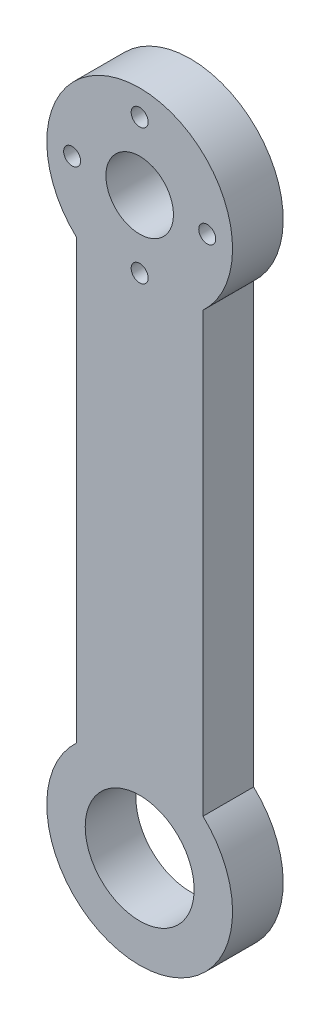
ISO-10303-21;
HEADER;
FILE_DESCRIPTION(('STEP AP214'),'2;1');
FILE_NAME('part.step','',(''),(''),'','','');
FILE_SCHEMA(('AUTOMOTIVE_DESIGN { 1 0 10303 214 1 1 1 1 }'));
ENDSEC;
DATA;
#1=APPLICATION_CONTEXT('core data for automotive mechanical design processes');
#2=APPLICATION_PROTOCOL_DEFINITION('international standard','automotive_design',2000,#1);
#3=PRODUCT_CONTEXT('',#1,'mechanical');
#4=PRODUCT('Part','Part','',(#3));
#5=PRODUCT_RELATED_PRODUCT_CATEGORY('part','',(#4));
#6=PRODUCT_DEFINITION_FORMATION('','',#4);
#7=PRODUCT_DEFINITION_CONTEXT('part definition',#1,'design');
#8=PRODUCT_DEFINITION('design','',#6,#7);
#9=PRODUCT_DEFINITION_SHAPE('','',#8);
#10=(LENGTH_UNIT() NAMED_UNIT(*) SI_UNIT(.MILLI.,.METRE.));
#11=(NAMED_UNIT(*) PLANE_ANGLE_UNIT() SI_UNIT($,.RADIAN.));
#12=(NAMED_UNIT(*) SI_UNIT($,.STERADIAN.) SOLID_ANGLE_UNIT());
#13=UNCERTAINTY_MEASURE_WITH_UNIT(LENGTH_MEASURE(1.E-05),#10,'distance_accuracy_value','');
#14=(GEOMETRIC_REPRESENTATION_CONTEXT(3) GLOBAL_UNCERTAINTY_ASSIGNED_CONTEXT((#13)) GLOBAL_UNIT_ASSIGNED_CONTEXT((#10,
#11,#12)) REPRESENTATION_CONTEXT('',''));
#15=CARTESIAN_POINT('',(0.,0.,0.));
#16=DIRECTION('',(0.,0.,1.));
#17=DIRECTION('',(1.,0.,0.));
#18=AXIS2_PLACEMENT_3D('',#15,#16,#17);
#19=CARTESIAN_POINT('',(7.5,67.5,10.));
#20=DIRECTION('',(0.,0.,-1.));
#21=DIRECTION('',(-1.,0.,0.));
#22=AXIS2_PLACEMENT_3D('',#19,#20,#21);
#23=CYLINDRICAL_SURFACE('',#22,1.00499999999999);
#24=CARTESIAN_POINT('',(7.5,67.5,6.));
#25=DIRECTION('',(0.,0.,-1.));
#26=DIRECTION('',(-1.,0.,0.));
#27=AXIS2_PLACEMENT_3D('',#24,#25,#26);
#28=CIRCLE('',#27,1.00499999999999);
#29=CARTESIAN_POINT('',(6.49500000000001,67.5,6.));
#30=VERTEX_POINT('',#29);
#31=EDGE_CURVE('E150',#30,#30,#28,.T.);
#32=ORIENTED_EDGE('',*,*,#31,.F.);
#33=EDGE_LOOP('',(#32));
#34=FACE_BOUND('',#33,.T.);
#35=CARTESIAN_POINT('',(7.5,67.5,4.));
#36=DIRECTION('',(0.,0.,-1.));
#37=DIRECTION('',(-1.,0.,0.));
#38=AXIS2_PLACEMENT_3D('',#35,#36,#37);
#39=CIRCLE('',#38,1.00499999999999);
#40=CARTESIAN_POINT('',(6.49500000000001,67.5,4.));
#41=VERTEX_POINT('',#40);
#42=EDGE_CURVE('E38',#41,#41,#39,.F.);
#43=ORIENTED_EDGE('',*,*,#42,.F.);
#44=EDGE_LOOP('',(#43));
#45=FACE_BOUND('',#44,.T.);
#46=ADVANCED_FACE('F34',(#34,#45),#23,.F.);
#47=CARTESIAN_POINT('',(-0.5,75.5,10.));
#48=DIRECTION('',(0.,0.,-1.));
#49=DIRECTION('',(-1.,0.,0.));
#50=AXIS2_PLACEMENT_3D('',#47,#48,#49);
#51=CYLINDRICAL_SURFACE('',#50,1.00499999999999);
#52=CARTESIAN_POINT('',(-0.5,75.5,6.));
#53=DIRECTION('',(0.,0.,-1.));
#54=DIRECTION('',(-1.,0.,0.));
#55=AXIS2_PLACEMENT_3D('',#52,#53,#54);
#56=CIRCLE('',#55,1.00499999999999);
#57=CARTESIAN_POINT('',(-1.50499999999999,75.5,6.));
#58=VERTEX_POINT('',#57);
#59=EDGE_CURVE('E141',#58,#58,#56,.T.);
#60=ORIENTED_EDGE('',*,*,#59,.F.);
#61=EDGE_LOOP('',(#60));
#62=FACE_BOUND('',#61,.T.);
#63=CARTESIAN_POINT('',(-0.5,75.5,4.));
#64=DIRECTION('',(0.,0.,-1.));
#65=DIRECTION('',(-1.,0.,0.));
#66=AXIS2_PLACEMENT_3D('',#63,#64,#65);
#67=CIRCLE('',#66,1.00499999999999);
#68=CARTESIAN_POINT('',(-1.50499999999999,75.5,4.));
#69=VERTEX_POINT('',#68);
#70=EDGE_CURVE('E111',#69,#69,#67,.F.);
#71=ORIENTED_EDGE('',*,*,#70,.F.);
#72=EDGE_LOOP('',(#71));
#73=FACE_BOUND('',#72,.T.);
#74=ADVANCED_FACE('F182',(#62,#73),#51,.F.);
#75=CARTESIAN_POINT('',(7.5,83.5,10.));
#76=DIRECTION('',(0.,0.,-1.));
#77=DIRECTION('',(-1.,0.,0.));
#78=AXIS2_PLACEMENT_3D('',#75,#76,#77);
#79=CYLINDRICAL_SURFACE('',#78,1.00500000000002);
#80=CARTESIAN_POINT('',(7.5,83.5,6.));
#81=DIRECTION('',(0.,0.,-1.));
#82=DIRECTION('',(-1.,0.,0.));
#83=AXIS2_PLACEMENT_3D('',#80,#81,#82);
#84=CIRCLE('',#83,1.00500000000002);
#85=CARTESIAN_POINT('',(6.49499999999998,83.5,6.));
#86=VERTEX_POINT('',#85);
#87=EDGE_CURVE('E144',#86,#86,#84,.T.);
#88=ORIENTED_EDGE('',*,*,#87,.F.);
#89=EDGE_LOOP('',(#88));
#90=FACE_BOUND('',#89,.T.);
#91=CARTESIAN_POINT('',(7.5,83.5,4.));
#92=DIRECTION('',(0.,0.,-1.));
#93=DIRECTION('',(-1.,0.,0.));
#94=AXIS2_PLACEMENT_3D('',#91,#92,#93);
#95=CIRCLE('',#94,1.00500000000002);
#96=CARTESIAN_POINT('',(6.49499999999998,83.5,4.));
#97=VERTEX_POINT('',#96);
#98=EDGE_CURVE('E107',#97,#97,#95,.F.);
#99=ORIENTED_EDGE('',*,*,#98,.F.);
#100=EDGE_LOOP('',(#99));
#101=FACE_BOUND('',#100,.T.);
#102=ADVANCED_FACE('F188',(#90,#101),#79,.F.);
#103=CARTESIAN_POINT('',(15.5,75.5,10.));
#104=DIRECTION('',(0.,0.,-1.));
#105=DIRECTION('',(-1.,0.,0.));
#106=AXIS2_PLACEMENT_3D('',#103,#104,#105);
#107=CYLINDRICAL_SURFACE('',#106,1.005);
#108=CARTESIAN_POINT('',(15.5,75.5,6.));
#109=DIRECTION('',(0.,0.,-1.));
#110=DIRECTION('',(-1.,0.,0.));
#111=AXIS2_PLACEMENT_3D('',#108,#109,#110);
#112=CIRCLE('',#111,1.005);
#113=CARTESIAN_POINT('',(14.495,75.5,6.));
#114=VERTEX_POINT('',#113);
#115=EDGE_CURVE('E147',#114,#114,#112,.T.);
#116=ORIENTED_EDGE('',*,*,#115,.F.);
#117=EDGE_LOOP('',(#116));
#118=FACE_BOUND('',#117,.T.);
#119=CARTESIAN_POINT('',(15.5,75.5,4.));
#120=DIRECTION('',(0.,0.,-1.));
#121=DIRECTION('',(-1.,0.,0.));
#122=AXIS2_PLACEMENT_3D('',#119,#120,#121);
#123=CIRCLE('',#122,1.005);
#124=CARTESIAN_POINT('',(14.495,75.5,4.));
#125=VERTEX_POINT('',#124);
#126=EDGE_CURVE('E102',#125,#125,#123,.F.);
#127=ORIENTED_EDGE('',*,*,#126,.F.);
#128=EDGE_LOOP('',(#127));
#129=FACE_BOUND('',#128,.T.);
#130=ADVANCED_FACE('F195',(#118,#129),#107,.F.);
#131=CARTESIAN_POINT('',(0.,0.,6.));
#132=DIRECTION('',(1.,0.,0.));
#133=DIRECTION('',(0.,0.,-1.));
#134=AXIS2_PLACEMENT_3D('',#131,#132,#133);
#135=PLANE('',#134);
#136=DIRECTION('',(0.,-1.,0.));
#137=VECTOR('',#136,1.);
#138=CARTESIAN_POINT('',(0.,0.,6.));
#139=LINE('',#138,#137);
#140=CARTESIAN_POINT('',(0.,67.4532615302845,6.));
#141=VERTEX_POINT('',#140);
#142=CARTESIAN_POINT('',(0.,15.5467384697156,6.));
#143=VERTEX_POINT('',#142);
#144=EDGE_CURVE('E43',#141,#143,#139,.T.);
#145=ORIENTED_EDGE('',*,*,#144,.F.);
#146=DIRECTION('',(0.,0.,1.));
#147=VECTOR('',#146,1.);
#148=CARTESIAN_POINT('',(0.,67.4532615302845,0.));
#149=LINE('',#148,#147);
#150=CARTESIAN_POINT('',(0.,67.4532615302845,0.));
#151=VERTEX_POINT('',#150);
#152=EDGE_CURVE('E77',#141,#151,#149,.F.);
#153=ORIENTED_EDGE('',*,*,#152,.T.);
#154=DIRECTION('',(0.,-1.,0.));
#155=VECTOR('',#154,1.);
#156=CARTESIAN_POINT('',(0.,0.,0.));
#157=LINE('',#156,#155);
#158=CARTESIAN_POINT('',(0.,15.5467384697156,0.));
#159=VERTEX_POINT('',#158);
#160=EDGE_CURVE('E88',#151,#159,#157,.T.);
#161=ORIENTED_EDGE('',*,*,#160,.T.);
#162=DIRECTION('',(0.,0.,1.));
#163=VECTOR('',#162,1.);
#164=CARTESIAN_POINT('',(0.,15.5467384697156,0.));
#165=LINE('',#164,#163);
#166=EDGE_CURVE('E95',#159,#143,#165,.T.);
#167=ORIENTED_EDGE('',*,*,#166,.T.);
#168=EDGE_LOOP('',(#145,#153,#161,#167));
#169=FACE_BOUND('',#168,.T.);
#170=ADVANCED_FACE('F36',(#169),#135,.F.);
#171=CARTESIAN_POINT('',(15.,0.,6.));
#172=DIRECTION('',(-1.,0.,0.));
#173=DIRECTION('',(0.,0.,1.));
#174=AXIS2_PLACEMENT_3D('',#171,#172,#173);
#175=PLANE('',#174);
#176=DIRECTION('',(0.,1.,0.));
#177=VECTOR('',#176,1.);
#178=CARTESIAN_POINT('',(15.,0.,0.));
#179=LINE('',#178,#177);
#180=CARTESIAN_POINT('',(15.,15.5467384697156,0.));
#181=VERTEX_POINT('',#180);
#182=CARTESIAN_POINT('',(15.,67.4532615302845,0.));
#183=VERTEX_POINT('',#182);
#184=EDGE_CURVE('E94',#181,#183,#179,.T.);
#185=ORIENTED_EDGE('',*,*,#184,.T.);
#186=DIRECTION('',(0.,0.,1.));
#187=VECTOR('',#186,1.);
#188=CARTESIAN_POINT('',(15.,67.4532615302845,0.));
#189=LINE('',#188,#187);
#190=CARTESIAN_POINT('',(15.,67.4532615302845,6.));
#191=VERTEX_POINT('',#190);
#192=EDGE_CURVE('E79',#183,#191,#189,.T.);
#193=ORIENTED_EDGE('',*,*,#192,.T.);
#194=DIRECTION('',(0.,1.,0.));
#195=VECTOR('',#194,1.);
#196=CARTESIAN_POINT('',(15.,0.,6.));
#197=LINE('',#196,#195);
#198=CARTESIAN_POINT('',(15.,15.5467384697156,6.));
#199=VERTEX_POINT('',#198);
#200=EDGE_CURVE('E11',#199,#191,#197,.T.);
#201=ORIENTED_EDGE('',*,*,#200,.F.);
#202=DIRECTION('',(0.,0.,1.));
#203=VECTOR('',#202,1.);
#204=CARTESIAN_POINT('',(15.,15.5467384697156,0.));
#205=LINE('',#204,#203);
#206=EDGE_CURVE('E98',#199,#181,#205,.F.);
#207=ORIENTED_EDGE('',*,*,#206,.T.);
#208=EDGE_LOOP('',(#185,#193,#201,#207));
#209=FACE_BOUND('',#208,.T.);
#210=ADVANCED_FACE('F166',(#209),#175,.F.);
#211=CARTESIAN_POINT('',(0.,0.,6.));
#212=DIRECTION('',(0.,0.,-1.));
#213=DIRECTION('',(-1.,0.,0.));
#214=AXIS2_PLACEMENT_3D('',#211,#212,#213);
#215=PLANE('',#214);
#216=CARTESIAN_POINT('',(7.5,7.5,6.));
#217=DIRECTION('',(0.,0.,-1.));
#218=DIRECTION('',(-1.,0.,0.));
#219=AXIS2_PLACEMENT_3D('',#216,#217,#218);
#220=CIRCLE('',#219,6.45);
#221=CARTESIAN_POINT('',(1.05,7.5,6.));
#222=VERTEX_POINT('',#221);
#223=EDGE_CURVE('E138',#222,#222,#220,.T.);
#224=ORIENTED_EDGE('',*,*,#223,.T.);
#225=EDGE_LOOP('',(#224));
#226=FACE_BOUND('',#225,.T.);
#227=ORIENTED_EDGE('',*,*,#59,.T.);
#228=EDGE_LOOP('',(#227));
#229=FACE_BOUND('',#228,.T.);
#230=ORIENTED_EDGE('',*,*,#87,.T.);
#231=EDGE_LOOP('',(#230));
#232=FACE_BOUND('',#231,.T.);
#233=ORIENTED_EDGE('',*,*,#115,.T.);
#234=EDGE_LOOP('',(#233));
#235=FACE_BOUND('',#234,.T.);
#236=ORIENTED_EDGE('',*,*,#31,.T.);
#237=EDGE_LOOP('',(#236));
#238=FACE_BOUND('',#237,.T.);
#239=CARTESIAN_POINT('',(7.5,75.5,6.));
#240=DIRECTION('',(0.,0.,-1.));
#241=DIRECTION('',(-1.,0.,0.));
#242=AXIS2_PLACEMENT_3D('',#239,#240,#241);
#243=CIRCLE('',#242,4.);
#244=CARTESIAN_POINT('',(3.5,75.5,6.));
#245=VERTEX_POINT('',#244);
#246=EDGE_CURVE('E156',#245,#245,#243,.T.);
#247=ORIENTED_EDGE('',*,*,#246,.T.);
#248=EDGE_LOOP('',(#247));
#249=FACE_BOUND('',#248,.T.);
#250=CARTESIAN_POINT('',(7.5,75.5,6.));
#251=DIRECTION('',(0.,0.,1.));
#252=DIRECTION('',(1.,0.,0.));
#253=AXIS2_PLACEMENT_3D('',#250,#251,#252);
#254=CIRCLE('',#253,11.);
#255=EDGE_CURVE('E84',#191,#141,#254,.T.);
#256=ORIENTED_EDGE('',*,*,#255,.T.);
#257=ORIENTED_EDGE('',*,*,#144,.T.);
#258=CARTESIAN_POINT('',(7.5,7.5,6.));
#259=DIRECTION('',(0.,0.,1.));
#260=DIRECTION('',(1.,0.,0.));
#261=AXIS2_PLACEMENT_3D('',#258,#259,#260);
#262=CIRCLE('',#261,11.);
#263=EDGE_CURVE('E50',#143,#199,#262,.T.);
#264=ORIENTED_EDGE('',*,*,#263,.T.);
#265=ORIENTED_EDGE('',*,*,#200,.T.);
#266=EDGE_LOOP('',(#256,#257,#264,#265));
#267=FACE_BOUND('',#266,.T.);
#268=ADVANCED_FACE('F177',(#226,#229,#232,#235,#238,#249,#267),#215,.F.);
#269=CARTESIAN_POINT('',(0.,0.,0.));
#270=DIRECTION('',(0.,0.,-1.));
#271=DIRECTION('',(-1.,0.,0.));
#272=AXIS2_PLACEMENT_3D('',#269,#270,#271);
#273=PLANE('',#272);
#274=CARTESIAN_POINT('',(7.5,67.5,0.));
#275=DIRECTION('',(0.,0.,-1.));
#276=DIRECTION('',(-1.,0.,0.));
#277=AXIS2_PLACEMENT_3D('',#274,#275,#276);
#278=CIRCLE('',#277,2.00000000000001);
#279=CARTESIAN_POINT('',(5.49999999999999,67.5,0.));
#280=VERTEX_POINT('',#279);
#281=EDGE_CURVE('E127',#280,#280,#278,.T.);
#282=ORIENTED_EDGE('',*,*,#281,.F.);
#283=EDGE_LOOP('',(#282));
#284=FACE_BOUND('',#283,.T.);
#285=CARTESIAN_POINT('',(-0.5,75.5,0.));
#286=DIRECTION('',(0.,0.,-1.));
#287=DIRECTION('',(-1.,0.,0.));
#288=AXIS2_PLACEMENT_3D('',#285,#286,#287);
#289=CIRCLE('',#288,2.00000000000001);
#290=CARTESIAN_POINT('',(-2.50000000000001,75.5,0.));
#291=VERTEX_POINT('',#290);
#292=EDGE_CURVE('E120',#291,#291,#289,.T.);
#293=ORIENTED_EDGE('',*,*,#292,.F.);
#294=EDGE_LOOP('',(#293));
#295=FACE_BOUND('',#294,.T.);
#296=CARTESIAN_POINT('',(7.5,83.5,0.));
#297=DIRECTION('',(0.,0.,-1.));
#298=DIRECTION('',(-1.,0.,0.));
#299=AXIS2_PLACEMENT_3D('',#296,#297,#298);
#300=CIRCLE('',#299,2.);
#301=CARTESIAN_POINT('',(5.5,83.5,0.));
#302=VERTEX_POINT('',#301);
#303=EDGE_CURVE('E113',#302,#302,#300,.T.);
#304=ORIENTED_EDGE('',*,*,#303,.F.);
#305=EDGE_LOOP('',(#304));
#306=FACE_BOUND('',#305,.T.);
#307=CARTESIAN_POINT('',(15.5,75.5,0.));
#308=DIRECTION('',(0.,0.,-1.));
#309=DIRECTION('',(-1.,0.,0.));
#310=AXIS2_PLACEMENT_3D('',#307,#308,#309);
#311=CIRCLE('',#310,2.);
#312=CARTESIAN_POINT('',(13.5,75.5,0.));
#313=VERTEX_POINT('',#312);
#314=EDGE_CURVE('E109',#313,#313,#311,.T.);
#315=ORIENTED_EDGE('',*,*,#314,.F.);
#316=EDGE_LOOP('',(#315));
#317=FACE_BOUND('',#316,.T.);
#318=CARTESIAN_POINT('',(7.5,7.5,0.));
#319=DIRECTION('',(0.,0.,-1.));
#320=DIRECTION('',(-1.,0.,0.));
#321=AXIS2_PLACEMENT_3D('',#318,#319,#320);
#322=CIRCLE('',#321,6.45);
#323=CARTESIAN_POINT('',(1.05,7.5,0.));
#324=VERTEX_POINT('',#323);
#325=EDGE_CURVE('E105',#324,#324,#322,.T.);
#326=ORIENTED_EDGE('',*,*,#325,.F.);
#327=EDGE_LOOP('',(#326));
#328=FACE_BOUND('',#327,.T.);
#329=CARTESIAN_POINT('',(7.5,75.5,0.));
#330=DIRECTION('',(0.,0.,-1.));
#331=DIRECTION('',(-1.,0.,0.));
#332=AXIS2_PLACEMENT_3D('',#329,#330,#331);
#333=CIRCLE('',#332,4.);
#334=CARTESIAN_POINT('',(3.5,75.5,0.));
#335=VERTEX_POINT('',#334);
#336=EDGE_CURVE('E153',#335,#335,#333,.T.);
#337=ORIENTED_EDGE('',*,*,#336,.F.);
#338=EDGE_LOOP('',(#337));
#339=FACE_BOUND('',#338,.T.);
#340=ORIENTED_EDGE('',*,*,#160,.F.);
#341=CARTESIAN_POINT('',(7.5,75.5,0.));
#342=DIRECTION('',(0.,0.,1.));
#343=DIRECTION('',(1.,0.,0.));
#344=AXIS2_PLACEMENT_3D('',#341,#342,#343);
#345=CIRCLE('',#344,11.);
#346=EDGE_CURVE('E74',#183,#151,#345,.T.);
#347=ORIENTED_EDGE('',*,*,#346,.F.);
#348=ORIENTED_EDGE('',*,*,#184,.F.);
#349=CARTESIAN_POINT('',(7.5,7.5,0.));
#350=DIRECTION('',(0.,0.,1.));
#351=DIRECTION('',(1.,0.,0.));
#352=AXIS2_PLACEMENT_3D('',#349,#350,#351);
#353=CIRCLE('',#352,11.);
#354=EDGE_CURVE('E93',#159,#181,#353,.T.);
#355=ORIENTED_EDGE('',*,*,#354,.F.);
#356=EDGE_LOOP('',(#340,#347,#348,#355));
#357=FACE_BOUND('',#356,.T.);
#358=ADVANCED_FACE('F92',(#284,#295,#306,#317,#328,#339,#357),#273,.T.);
#359=CARTESIAN_POINT('',(7.5,7.5,0.));
#360=DIRECTION('',(0.,0.,1.));
#361=DIRECTION('',(1.,0.,0.));
#362=AXIS2_PLACEMENT_3D('',#359,#360,#361);
#363=CYLINDRICAL_SURFACE('',#362,11.);
#364=ORIENTED_EDGE('',*,*,#166,.F.);
#365=ORIENTED_EDGE('',*,*,#354,.T.);
#366=ORIENTED_EDGE('',*,*,#206,.F.);
#367=ORIENTED_EDGE('',*,*,#263,.F.);
#368=EDGE_LOOP('',(#364,#365,#366,#367));
#369=FACE_BOUND('',#368,.T.);
#370=ADVANCED_FACE('F168',(#369),#363,.T.);
#371=CARTESIAN_POINT('',(7.5,75.5,0.));
#372=DIRECTION('',(0.,0.,1.));
#373=DIRECTION('',(1.,0.,0.));
#374=AXIS2_PLACEMENT_3D('',#371,#372,#373);
#375=CYLINDRICAL_SURFACE('',#374,11.);
#376=ORIENTED_EDGE('',*,*,#152,.F.);
#377=ORIENTED_EDGE('',*,*,#255,.F.);
#378=ORIENTED_EDGE('',*,*,#192,.F.);
#379=ORIENTED_EDGE('',*,*,#346,.T.);
#380=EDGE_LOOP('',(#376,#377,#378,#379));
#381=FACE_BOUND('',#380,.T.);
#382=ADVANCED_FACE('F76',(#381),#375,.T.);
#383=CARTESIAN_POINT('',(7.5,75.5,10.));
#384=DIRECTION('',(0.,0.,-1.));
#385=DIRECTION('',(-1.,0.,0.));
#386=AXIS2_PLACEMENT_3D('',#383,#384,#385);
#387=CYLINDRICAL_SURFACE('',#386,4.);
#388=ORIENTED_EDGE('',*,*,#336,.T.);
#389=EDGE_LOOP('',(#388));
#390=FACE_BOUND('',#389,.T.);
#391=ORIENTED_EDGE('',*,*,#246,.F.);
#392=EDGE_LOOP('',(#391));
#393=FACE_BOUND('',#392,.T.);
#394=ADVANCED_FACE('F175',(#390,#393),#387,.F.);
#395=CARTESIAN_POINT('',(7.5,7.5,10.));
#396=DIRECTION('',(0.,0.,-1.));
#397=DIRECTION('',(-1.,0.,0.));
#398=AXIS2_PLACEMENT_3D('',#395,#396,#397);
#399=CYLINDRICAL_SURFACE('',#398,6.45);
#400=ORIENTED_EDGE('',*,*,#325,.T.);
#401=EDGE_LOOP('',(#400));
#402=FACE_BOUND('',#401,.T.);
#403=ORIENTED_EDGE('',*,*,#223,.F.);
#404=EDGE_LOOP('',(#403));
#405=FACE_BOUND('',#404,.T.);
#406=ADVANCED_FACE('F198',(#402,#405),#399,.F.);
#407=CARTESIAN_POINT('',(15.5,75.5,4.));
#408=DIRECTION('',(0.,0.,-1.));
#409=DIRECTION('',(-1.,0.,0.));
#410=AXIS2_PLACEMENT_3D('',#407,#408,#409);
#411=PLANE('',#410);
#412=CARTESIAN_POINT('',(15.5,75.5,4.));
#413=DIRECTION('',(0.,0.,-1.));
#414=DIRECTION('',(-1.,0.,0.));
#415=AXIS2_PLACEMENT_3D('',#412,#413,#414);
#416=CIRCLE('',#415,2.);
#417=CARTESIAN_POINT('',(13.5,75.5,4.));
#418=VERTEX_POINT('',#417);
#419=EDGE_CURVE('E106',#418,#418,#416,.T.);
#420=ORIENTED_EDGE('',*,*,#419,.T.);
#421=EDGE_LOOP('',(#420));
#422=FACE_BOUND('',#421,.T.);
#423=ORIENTED_EDGE('',*,*,#126,.T.);
#424=EDGE_LOOP('',(#423));
#425=FACE_BOUND('',#424,.T.);
#426=ADVANCED_FACE('F203',(#422,#425),#411,.T.);
#427=CARTESIAN_POINT('',(15.5,75.5,4.));
#428=DIRECTION('',(0.,0.,-1.));
#429=DIRECTION('',(-1.,0.,0.));
#430=AXIS2_PLACEMENT_3D('',#427,#428,#429);
#431=CYLINDRICAL_SURFACE('',#430,2.);
#432=ORIENTED_EDGE('',*,*,#419,.F.);
#433=EDGE_LOOP('',(#432));
#434=FACE_BOUND('',#433,.T.);
#435=ORIENTED_EDGE('',*,*,#314,.T.);
#436=EDGE_LOOP('',(#435));
#437=FACE_BOUND('',#436,.T.);
#438=ADVANCED_FACE('F229',(#434,#437),#431,.F.);
#439=CARTESIAN_POINT('',(7.5,83.5,4.));
#440=DIRECTION('',(0.,0.,-1.));
#441=DIRECTION('',(-1.,0.,0.));
#442=AXIS2_PLACEMENT_3D('',#439,#440,#441);
#443=PLANE('',#442);
#444=CARTESIAN_POINT('',(7.5,83.5,4.));
#445=DIRECTION('',(0.,0.,-1.));
#446=DIRECTION('',(-1.,0.,0.));
#447=AXIS2_PLACEMENT_3D('',#444,#445,#446);
#448=CIRCLE('',#447,2.);
#449=CARTESIAN_POINT('',(5.5,83.5,4.));
#450=VERTEX_POINT('',#449);
#451=EDGE_CURVE('E110',#450,#450,#448,.T.);
#452=ORIENTED_EDGE('',*,*,#451,.T.);
#453=EDGE_LOOP('',(#452));
#454=FACE_BOUND('',#453,.T.);
#455=ORIENTED_EDGE('',*,*,#98,.T.);
#456=EDGE_LOOP('',(#455));
#457=FACE_BOUND('',#456,.T.);
#458=ADVANCED_FACE('F235',(#454,#457),#443,.T.);
#459=CARTESIAN_POINT('',(7.5,83.5,4.));
#460=DIRECTION('',(0.,0.,-1.));
#461=DIRECTION('',(-1.,0.,0.));
#462=AXIS2_PLACEMENT_3D('',#459,#460,#461);
#463=CYLINDRICAL_SURFACE('',#462,2.);
#464=ORIENTED_EDGE('',*,*,#451,.F.);
#465=EDGE_LOOP('',(#464));
#466=FACE_BOUND('',#465,.T.);
#467=ORIENTED_EDGE('',*,*,#303,.T.);
#468=EDGE_LOOP('',(#467));
#469=FACE_BOUND('',#468,.T.);
#470=ADVANCED_FACE('F239',(#466,#469),#463,.F.);
#471=CARTESIAN_POINT('',(-0.5,75.5,4.));
#472=DIRECTION('',(0.,0.,-1.));
#473=DIRECTION('',(-1.,0.,0.));
#474=AXIS2_PLACEMENT_3D('',#471,#472,#473);
#475=PLANE('',#474);
#476=CARTESIAN_POINT('',(-0.5,75.5,4.));
#477=DIRECTION('',(0.,0.,-1.));
#478=DIRECTION('',(-1.,0.,0.));
#479=AXIS2_PLACEMENT_3D('',#476,#477,#478);
#480=CIRCLE('',#479,2.00000000000001);
#481=CARTESIAN_POINT('',(-2.50000000000001,75.5,4.));
#482=VERTEX_POINT('',#481);
#483=EDGE_CURVE('E114',#482,#482,#480,.T.);
#484=ORIENTED_EDGE('',*,*,#483,.T.);
#485=EDGE_LOOP('',(#484));
#486=FACE_BOUND('',#485,.T.);
#487=ORIENTED_EDGE('',*,*,#70,.T.);
#488=EDGE_LOOP('',(#487));
#489=FACE_BOUND('',#488,.T.);
#490=ADVANCED_FACE('F253',(#486,#489),#475,.T.);
#491=CARTESIAN_POINT('',(-0.5,75.5,4.));
#492=DIRECTION('',(0.,0.,-1.));
#493=DIRECTION('',(-1.,0.,0.));
#494=AXIS2_PLACEMENT_3D('',#491,#492,#493);
#495=CYLINDRICAL_SURFACE('',#494,2.00000000000001);
#496=ORIENTED_EDGE('',*,*,#483,.F.);
#497=EDGE_LOOP('',(#496));
#498=FACE_BOUND('',#497,.T.);
#499=ORIENTED_EDGE('',*,*,#292,.T.);
#500=EDGE_LOOP('',(#499));
#501=FACE_BOUND('',#500,.T.);
#502=ADVANCED_FACE('F256',(#498,#501),#495,.F.);
#503=CARTESIAN_POINT('',(7.5,67.5,4.));
#504=DIRECTION('',(0.,0.,-1.));
#505=DIRECTION('',(-1.,0.,0.));
#506=AXIS2_PLACEMENT_3D('',#503,#504,#505);
#507=PLANE('',#506);
#508=CARTESIAN_POINT('',(7.5,67.5,4.));
#509=DIRECTION('',(0.,0.,-1.));
#510=DIRECTION('',(-1.,0.,0.));
#511=AXIS2_PLACEMENT_3D('',#508,#509,#510);
#512=CIRCLE('',#511,2.00000000000001);
#513=CARTESIAN_POINT('',(5.49999999999999,67.5,4.));
#514=VERTEX_POINT('',#513);
#515=EDGE_CURVE('E274',#514,#514,#512,.T.);
#516=ORIENTED_EDGE('',*,*,#515,.T.);
#517=EDGE_LOOP('',(#516));
#518=FACE_BOUND('',#517,.T.);
#519=ORIENTED_EDGE('',*,*,#42,.T.);
#520=EDGE_LOOP('',(#519));
#521=FACE_BOUND('',#520,.T.);
#522=ADVANCED_FACE('F259',(#518,#521),#507,.T.);
#523=CARTESIAN_POINT('',(7.5,67.5,4.));
#524=DIRECTION('',(0.,0.,-1.));
#525=DIRECTION('',(-1.,0.,0.));
#526=AXIS2_PLACEMENT_3D('',#523,#524,#525);
#527=CYLINDRICAL_SURFACE('',#526,2.00000000000001);
#528=ORIENTED_EDGE('',*,*,#515,.F.);
#529=EDGE_LOOP('',(#528));
#530=FACE_BOUND('',#529,.T.);
#531=ORIENTED_EDGE('',*,*,#281,.T.);
#532=EDGE_LOOP('',(#531));
#533=FACE_BOUND('',#532,.T.);
#534=ADVANCED_FACE('F263',(#530,#533),#527,.F.);
#535=CLOSED_SHELL('',(#46,#74,#102,#130,#170,#210,#268,#358,#370,#382,#394,#406,#426,#438,#458,
#470,#490,#502,#522,#534));
#536=MANIFOLD_SOLID_BREP('B2',#535);
#537=ADVANCED_BREP_SHAPE_REPRESENTATION('',(#18,#536),#14);
#538=SHAPE_DEFINITION_REPRESENTATION(#9,#537);
ENDSEC;
END-ISO-10303-21;
